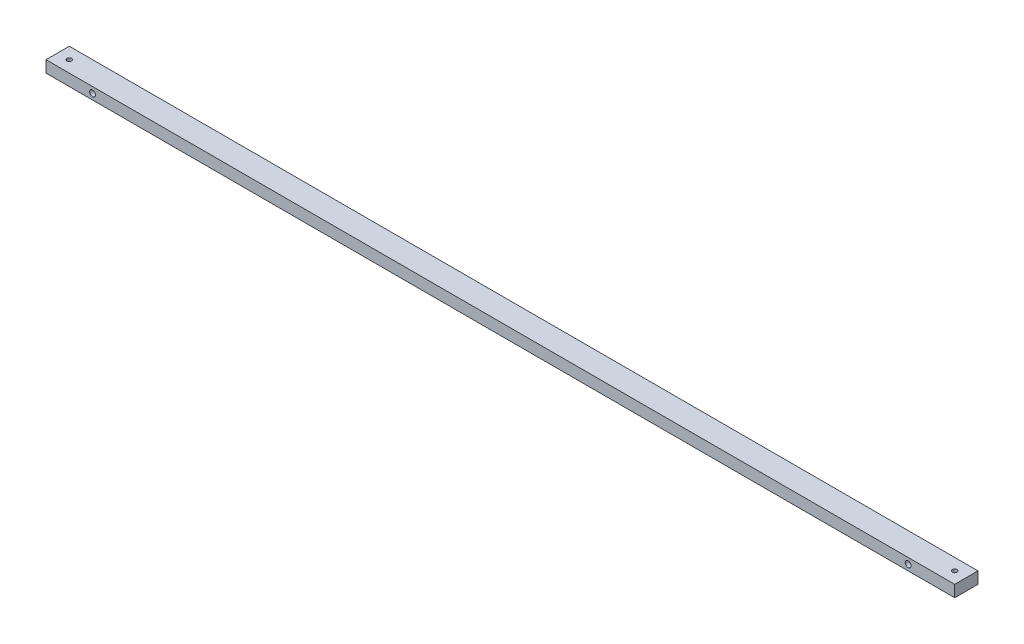
ISO-10303-21;
HEADER;
FILE_DESCRIPTION(('STEP AP214'),'2;1');
FILE_NAME('part.step','',(''),(''),'','','');
FILE_SCHEMA(('AUTOMOTIVE_DESIGN { 1 0 10303 214 1 1 1 1 }'));
ENDSEC;
DATA;
#1=APPLICATION_CONTEXT('core data for automotive mechanical design processes');
#2=APPLICATION_PROTOCOL_DEFINITION('international standard','automotive_design',2000,#1);
#3=PRODUCT_CONTEXT('',#1,'mechanical');
#4=PRODUCT('Part','Part','',(#3));
#5=PRODUCT_RELATED_PRODUCT_CATEGORY('part','',(#4));
#6=PRODUCT_DEFINITION_FORMATION('','',#4);
#7=PRODUCT_DEFINITION_CONTEXT('part definition',#1,'design');
#8=PRODUCT_DEFINITION('design','',#6,#7);
#9=PRODUCT_DEFINITION_SHAPE('','',#8);
#10=(LENGTH_UNIT() NAMED_UNIT(*) SI_UNIT(.MILLI.,.METRE.));
#11=(NAMED_UNIT(*) PLANE_ANGLE_UNIT() SI_UNIT($,.RADIAN.));
#12=(NAMED_UNIT(*) SI_UNIT($,.STERADIAN.) SOLID_ANGLE_UNIT());
#13=UNCERTAINTY_MEASURE_WITH_UNIT(LENGTH_MEASURE(1.E-05),#10,'distance_accuracy_value','');
#14=(GEOMETRIC_REPRESENTATION_CONTEXT(3) GLOBAL_UNCERTAINTY_ASSIGNED_CONTEXT((#13)) GLOBAL_UNIT_ASSIGNED_CONTEXT((#10,
#11,#12)) REPRESENTATION_CONTEXT('',''));
#15=CARTESIAN_POINT('',(0.,0.,0.));
#16=DIRECTION('',(0.,0.,1.));
#17=DIRECTION('',(1.,0.,0.));
#18=AXIS2_PLACEMENT_3D('',#15,#16,#17);
#19=CARTESIAN_POINT('',(990.6,0.,0.));
#20=DIRECTION('',(0.,0.,-1.));
#21=DIRECTION('',(0.,1.,0.));
#22=AXIS2_PLACEMENT_3D('',#19,#20,#21);
#23=PLANE('',#22);
#24=CARTESIAN_POINT('',(939.8,6.34999999999999,0.));
#25=DIRECTION('',(0.,0.,-1.));
#26=DIRECTION('',(0.,1.,0.));
#27=AXIS2_PLACEMENT_3D('',#24,#25,#26);
#28=CIRCLE('',#27,3.17500000000004);
#29=CARTESIAN_POINT('',(939.8,9.52500000000003,0.));
#30=VERTEX_POINT('',#29);
#31=EDGE_CURVE('E151',#30,#30,#28,.T.);
#32=ORIENTED_EDGE('',*,*,#31,.T.);
#33=EDGE_LOOP('',(#32));
#34=FACE_BOUND('',#33,.T.);
#35=CARTESIAN_POINT('',(50.8,6.34999999999999,0.));
#36=DIRECTION('',(0.,0.,-1.));
#37=DIRECTION('',(0.,1.,0.));
#38=AXIS2_PLACEMENT_3D('',#35,#36,#37);
#39=CIRCLE('',#38,3.175);
#40=CARTESIAN_POINT('',(50.8,9.52499999999998,0.));
#41=VERTEX_POINT('',#40);
#42=EDGE_CURVE('E143',#41,#41,#39,.T.);
#43=ORIENTED_EDGE('',*,*,#42,.T.);
#44=EDGE_LOOP('',(#43));
#45=FACE_BOUND('',#44,.T.);
#46=DIRECTION('',(0.,-1.,0.));
#47=VECTOR('',#46,1.);
#48=CARTESIAN_POINT('',(0.,0.,0.));
#49=LINE('',#48,#47);
#50=CARTESIAN_POINT('',(0.,12.7,0.));
#51=VERTEX_POINT('',#50);
#52=CARTESIAN_POINT('',(0.,0.,0.));
#53=VERTEX_POINT('',#52);
#54=EDGE_CURVE('E107',#51,#53,#49,.T.);
#55=ORIENTED_EDGE('',*,*,#54,.T.);
#56=DIRECTION('',(-1.,0.,0.));
#57=VECTOR('',#56,1.);
#58=CARTESIAN_POINT('',(990.6,0.,0.));
#59=LINE('',#58,#57);
#60=CARTESIAN_POINT('',(990.6,0.,0.));
#61=VERTEX_POINT('',#60);
#62=EDGE_CURVE('E11',#61,#53,#59,.T.);
#63=ORIENTED_EDGE('',*,*,#62,.F.);
#64=DIRECTION('',(0.,-1.,0.));
#65=VECTOR('',#64,1.);
#66=CARTESIAN_POINT('',(990.6,0.,0.));
#67=LINE('',#66,#65);
#68=CARTESIAN_POINT('',(990.6,12.7,0.));
#69=VERTEX_POINT('',#68);
#70=EDGE_CURVE('E91',#69,#61,#67,.T.);
#71=ORIENTED_EDGE('',*,*,#70,.F.);
#72=DIRECTION('',(-1.,0.,0.));
#73=VECTOR('',#72,1.);
#74=CARTESIAN_POINT('',(990.6,12.7,0.));
#75=LINE('',#74,#73);
#76=EDGE_CURVE('E103',#69,#51,#75,.T.);
#77=ORIENTED_EDGE('',*,*,#76,.T.);
#78=EDGE_LOOP('',(#55,#63,#71,#77));
#79=FACE_BOUND('',#78,.T.);
#80=ADVANCED_FACE('F39',(#34,#45,#79),#23,.F.);
#81=CARTESIAN_POINT('',(990.6,0.,0.));
#82=DIRECTION('',(0.,1.,0.));
#83=DIRECTION('',(0.,0.,1.));
#84=AXIS2_PLACEMENT_3D('',#81,#82,#83);
#85=PLANE('',#84);
#86=CARTESIAN_POINT('',(12.6999999999999,0.,-12.7));
#87=DIRECTION('',(0.,1.,0.));
#88=DIRECTION('',(0.,0.,1.));
#89=AXIS2_PLACEMENT_3D('',#86,#87,#88);
#90=CIRCLE('',#89,2.55269999999999);
#91=CARTESIAN_POINT('',(12.6999999999999,0.,-10.1473));
#92=VERTEX_POINT('',#91);
#93=EDGE_CURVE('E135',#92,#92,#90,.T.);
#94=ORIENTED_EDGE('',*,*,#93,.T.);
#95=EDGE_LOOP('',(#94));
#96=FACE_BOUND('',#95,.T.);
#97=CARTESIAN_POINT('',(977.9,0.,-12.7));
#98=DIRECTION('',(0.,1.,0.));
#99=DIRECTION('',(0.,0.,1.));
#100=AXIS2_PLACEMENT_3D('',#97,#98,#99);
#101=CIRCLE('',#100,2.55269999999996);
#102=CARTESIAN_POINT('',(977.9,0.,-10.1473));
#103=VERTEX_POINT('',#102);
#104=EDGE_CURVE('E111',#103,#103,#101,.T.);
#105=ORIENTED_EDGE('',*,*,#104,.T.);
#106=EDGE_LOOP('',(#105));
#107=FACE_BOUND('',#106,.T.);
#108=DIRECTION('',(0.,0.,-1.));
#109=VECTOR('',#108,1.);
#110=CARTESIAN_POINT('',(0.,0.,0.));
#111=LINE('',#110,#109);
#112=CARTESIAN_POINT('',(0.,0.,-25.4));
#113=VERTEX_POINT('',#112);
#114=EDGE_CURVE('E96',#53,#113,#111,.T.);
#115=ORIENTED_EDGE('',*,*,#114,.T.);
#116=DIRECTION('',(-1.,0.,0.));
#117=VECTOR('',#116,1.);
#118=CARTESIAN_POINT('',(990.6,0.,-25.4));
#119=LINE('',#118,#117);
#120=CARTESIAN_POINT('',(990.6,0.,-25.4));
#121=VERTEX_POINT('',#120);
#122=EDGE_CURVE('E48',#121,#113,#119,.T.);
#123=ORIENTED_EDGE('',*,*,#122,.F.);
#124=DIRECTION('',(0.,0.,-1.));
#125=VECTOR('',#124,1.);
#126=CARTESIAN_POINT('',(990.6,0.,0.));
#127=LINE('',#126,#125);
#128=EDGE_CURVE('E86',#61,#121,#127,.T.);
#129=ORIENTED_EDGE('',*,*,#128,.F.);
#130=ORIENTED_EDGE('',*,*,#62,.T.);
#131=EDGE_LOOP('',(#115,#123,#129,#130));
#132=FACE_BOUND('',#131,.T.);
#133=ADVANCED_FACE('F95',(#96,#107,#132),#85,.F.);
#134=CARTESIAN_POINT('',(990.6,0.,-25.4));
#135=DIRECTION('',(0.,0.,1.));
#136=DIRECTION('',(0.,-1.,0.));
#137=AXIS2_PLACEMENT_3D('',#134,#135,#136);
#138=PLANE('',#137);
#139=CARTESIAN_POINT('',(939.8,6.35,-25.4));
#140=DIRECTION('',(0.,0.,-1.));
#141=DIRECTION('',(0.,1.,0.));
#142=AXIS2_PLACEMENT_3D('',#139,#140,#141);
#143=CIRCLE('',#142,3.17500000000004);
#144=CARTESIAN_POINT('',(939.8,9.52500000000004,-25.4));
#145=VERTEX_POINT('',#144);
#146=EDGE_CURVE('E155',#145,#145,#143,.T.);
#147=ORIENTED_EDGE('',*,*,#146,.F.);
#148=EDGE_LOOP('',(#147));
#149=FACE_BOUND('',#148,.T.);
#150=CARTESIAN_POINT('',(50.8,6.35,-25.4));
#151=DIRECTION('',(0.,0.,-1.));
#152=DIRECTION('',(0.,1.,0.));
#153=AXIS2_PLACEMENT_3D('',#150,#151,#152);
#154=CIRCLE('',#153,3.175);
#155=CARTESIAN_POINT('',(50.8,9.525,-25.4));
#156=VERTEX_POINT('',#155);
#157=EDGE_CURVE('E147',#156,#156,#154,.T.);
#158=ORIENTED_EDGE('',*,*,#157,.F.);
#159=EDGE_LOOP('',(#158));
#160=FACE_BOUND('',#159,.T.);
#161=DIRECTION('',(0.,1.,0.));
#162=VECTOR('',#161,1.);
#163=CARTESIAN_POINT('',(0.,0.,-25.4));
#164=LINE('',#163,#162);
#165=CARTESIAN_POINT('',(0.,12.7,-25.4));
#166=VERTEX_POINT('',#165);
#167=EDGE_CURVE('E73',#113,#166,#164,.T.);
#168=ORIENTED_EDGE('',*,*,#167,.T.);
#169=DIRECTION('',(-1.,0.,0.));
#170=VECTOR('',#169,1.);
#171=CARTESIAN_POINT('',(990.6,12.7,-25.4));
#172=LINE('',#171,#170);
#173=CARTESIAN_POINT('',(990.6,12.7,-25.4));
#174=VERTEX_POINT('',#173);
#175=EDGE_CURVE('E98',#174,#166,#172,.T.);
#176=ORIENTED_EDGE('',*,*,#175,.F.);
#177=DIRECTION('',(0.,1.,0.));
#178=VECTOR('',#177,1.);
#179=CARTESIAN_POINT('',(990.6,0.,-25.4));
#180=LINE('',#179,#178);
#181=EDGE_CURVE('E89',#121,#174,#180,.T.);
#182=ORIENTED_EDGE('',*,*,#181,.F.);
#183=ORIENTED_EDGE('',*,*,#122,.T.);
#184=EDGE_LOOP('',(#168,#176,#182,#183));
#185=FACE_BOUND('',#184,.T.);
#186=ADVANCED_FACE('F99',(#149,#160,#185),#138,.F.);
#187=CARTESIAN_POINT('',(990.6,12.7,0.));
#188=DIRECTION('',(0.,-1.,0.));
#189=DIRECTION('',(0.,0.,-1.));
#190=AXIS2_PLACEMENT_3D('',#187,#188,#189);
#191=PLANE('',#190);
#192=CARTESIAN_POINT('',(12.6999999999999,12.7,-12.7));
#193=DIRECTION('',(0.,1.,0.));
#194=DIRECTION('',(0.,0.,1.));
#195=AXIS2_PLACEMENT_3D('',#192,#193,#194);
#196=CIRCLE('',#195,2.55269999999999);
#197=CARTESIAN_POINT('',(12.6999999999999,12.7,-10.1473));
#198=VERTEX_POINT('',#197);
#199=EDGE_CURVE('E139',#198,#198,#196,.T.);
#200=ORIENTED_EDGE('',*,*,#199,.F.);
#201=EDGE_LOOP('',(#200));
#202=FACE_BOUND('',#201,.T.);
#203=CARTESIAN_POINT('',(977.9,12.7,-12.7));
#204=DIRECTION('',(0.,1.,0.));
#205=DIRECTION('',(0.,0.,1.));
#206=AXIS2_PLACEMENT_3D('',#203,#204,#205);
#207=CIRCLE('',#206,2.55269999999996);
#208=CARTESIAN_POINT('',(977.9,12.7,-10.1473));
#209=VERTEX_POINT('',#208);
#210=EDGE_CURVE('E131',#209,#209,#207,.T.);
#211=ORIENTED_EDGE('',*,*,#210,.F.);
#212=EDGE_LOOP('',(#211));
#213=FACE_BOUND('',#212,.T.);
#214=DIRECTION('',(0.,0.,1.));
#215=VECTOR('',#214,1.);
#216=CARTESIAN_POINT('',(0.,12.7,0.));
#217=LINE('',#216,#215);
#218=EDGE_CURVE('E79',#166,#51,#217,.T.);
#219=ORIENTED_EDGE('',*,*,#218,.T.);
#220=ORIENTED_EDGE('',*,*,#76,.F.);
#221=DIRECTION('',(0.,0.,1.));
#222=VECTOR('',#221,1.);
#223=CARTESIAN_POINT('',(990.6,12.7,0.));
#224=LINE('',#223,#222);
#225=EDGE_CURVE('E56',#174,#69,#224,.T.);
#226=ORIENTED_EDGE('',*,*,#225,.F.);
#227=ORIENTED_EDGE('',*,*,#175,.T.);
#228=EDGE_LOOP('',(#219,#220,#226,#227));
#229=FACE_BOUND('',#228,.T.);
#230=ADVANCED_FACE('F121',(#202,#213,#229),#191,.F.);
#231=CARTESIAN_POINT('',(990.6,0.,0.));
#232=DIRECTION('',(-1.,0.,0.));
#233=DIRECTION('',(0.,0.,1.));
#234=AXIS2_PLACEMENT_3D('',#231,#232,#233);
#235=PLANE('',#234);
#236=ORIENTED_EDGE('',*,*,#70,.T.);
#237=ORIENTED_EDGE('',*,*,#128,.T.);
#238=ORIENTED_EDGE('',*,*,#181,.T.);
#239=ORIENTED_EDGE('',*,*,#225,.T.);
#240=EDGE_LOOP('',(#236,#237,#238,#239));
#241=FACE_BOUND('',#240,.T.);
#242=ADVANCED_FACE('F87',(#241),#235,.F.);
#243=CARTESIAN_POINT('',(0.,0.,0.));
#244=DIRECTION('',(-1.,0.,0.));
#245=DIRECTION('',(0.,0.,1.));
#246=AXIS2_PLACEMENT_3D('',#243,#244,#245);
#247=PLANE('',#246);
#248=ORIENTED_EDGE('',*,*,#54,.F.);
#249=ORIENTED_EDGE('',*,*,#218,.F.);
#250=ORIENTED_EDGE('',*,*,#167,.F.);
#251=ORIENTED_EDGE('',*,*,#114,.F.);
#252=EDGE_LOOP('',(#248,#249,#250,#251));
#253=FACE_BOUND('',#252,.T.);
#254=ADVANCED_FACE('F124',(#253),#247,.T.);
#255=CARTESIAN_POINT('',(977.9,12.7,-12.7));
#256=DIRECTION('',(0.,1.,0.));
#257=DIRECTION('',(0.,0.,1.));
#258=AXIS2_PLACEMENT_3D('',#255,#256,#257);
#259=CYLINDRICAL_SURFACE('',#258,2.55269999999996);
#260=ORIENTED_EDGE('',*,*,#104,.F.);
#261=EDGE_LOOP('',(#260));
#262=FACE_BOUND('',#261,.T.);
#263=ORIENTED_EDGE('',*,*,#210,.T.);
#264=EDGE_LOOP('',(#263));
#265=FACE_BOUND('',#264,.T.);
#266=ADVANCED_FACE('F178',(#262,#265),#259,.F.);
#267=CARTESIAN_POINT('',(12.6999999999999,12.7,-12.7));
#268=DIRECTION('',(0.,1.,0.));
#269=DIRECTION('',(0.,0.,1.));
#270=AXIS2_PLACEMENT_3D('',#267,#268,#269);
#271=CYLINDRICAL_SURFACE('',#270,2.55269999999999);
#272=ORIENTED_EDGE('',*,*,#93,.F.);
#273=EDGE_LOOP('',(#272));
#274=FACE_BOUND('',#273,.T.);
#275=ORIENTED_EDGE('',*,*,#199,.T.);
#276=EDGE_LOOP('',(#275));
#277=FACE_BOUND('',#276,.T.);
#278=ADVANCED_FACE('F169',(#274,#277),#271,.F.);
#279=CARTESIAN_POINT('',(50.8,6.35,-25.4));
#280=DIRECTION('',(0.,0.,-1.));
#281=DIRECTION('',(0.,1.,0.));
#282=AXIS2_PLACEMENT_3D('',#279,#280,#281);
#283=CYLINDRICAL_SURFACE('',#282,3.175);
#284=ORIENTED_EDGE('',*,*,#42,.F.);
#285=EDGE_LOOP('',(#284));
#286=FACE_BOUND('',#285,.T.);
#287=ORIENTED_EDGE('',*,*,#157,.T.);
#288=EDGE_LOOP('',(#287));
#289=FACE_BOUND('',#288,.T.);
#290=ADVANCED_FACE('F167',(#286,#289),#283,.F.);
#291=CARTESIAN_POINT('',(939.8,6.35,-25.4));
#292=DIRECTION('',(0.,0.,-1.));
#293=DIRECTION('',(0.,1.,0.));
#294=AXIS2_PLACEMENT_3D('',#291,#292,#293);
#295=CYLINDRICAL_SURFACE('',#294,3.17500000000004);
#296=ORIENTED_EDGE('',*,*,#31,.F.);
#297=EDGE_LOOP('',(#296));
#298=FACE_BOUND('',#297,.T.);
#299=ORIENTED_EDGE('',*,*,#146,.T.);
#300=EDGE_LOOP('',(#299));
#301=FACE_BOUND('',#300,.T.);
#302=ADVANCED_FACE('F160',(#298,#301),#295,.F.);
#303=CLOSED_SHELL('',(#80,#133,#186,#230,#242,#254,#266,#278,#290,#302));
#304=MANIFOLD_SOLID_BREP('B2',#303);
#305=ADVANCED_BREP_SHAPE_REPRESENTATION('',(#18,#304),#14);
#306=SHAPE_DEFINITION_REPRESENTATION(#9,#305);
ENDSEC;
END-ISO-10303-21;
